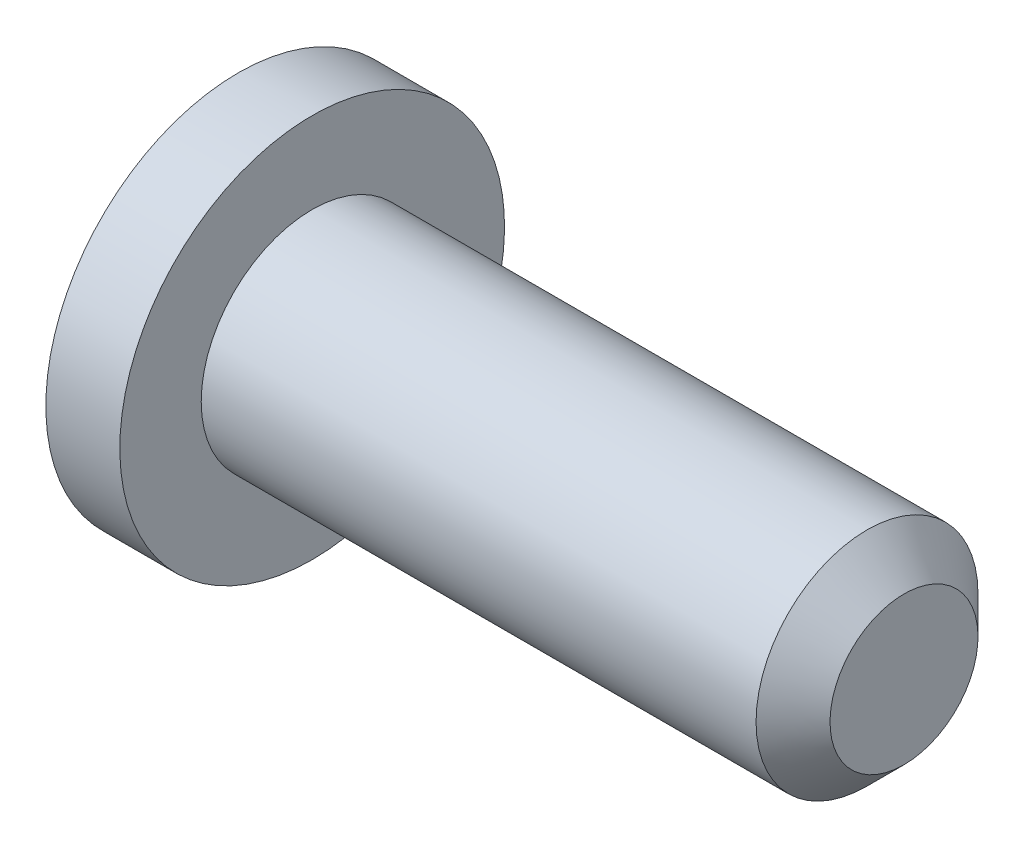
ISO-10303-21;
HEADER;
FILE_DESCRIPTION(('STEP AP214'),'2;1');
FILE_NAME('part.step','',(''),(''),'','','');
FILE_SCHEMA(('AUTOMOTIVE_DESIGN { 1 0 10303 214 1 1 1 1 }'));
ENDSEC;
DATA;
#1=APPLICATION_CONTEXT('core data for automotive mechanical design processes');
#2=APPLICATION_PROTOCOL_DEFINITION('international standard','automotive_design',2000,#1);
#3=PRODUCT_CONTEXT('',#1,'mechanical');
#4=PRODUCT('Part','Part','',(#3));
#5=PRODUCT_RELATED_PRODUCT_CATEGORY('part','',(#4));
#6=PRODUCT_DEFINITION_FORMATION('','',#4);
#7=PRODUCT_DEFINITION_CONTEXT('part definition',#1,'design');
#8=PRODUCT_DEFINITION('design','',#6,#7);
#9=PRODUCT_DEFINITION_SHAPE('','',#8);
#10=(LENGTH_UNIT() NAMED_UNIT(*) SI_UNIT(.MILLI.,.METRE.));
#11=(NAMED_UNIT(*) PLANE_ANGLE_UNIT() SI_UNIT($,.RADIAN.));
#12=(NAMED_UNIT(*) SI_UNIT($,.STERADIAN.) SOLID_ANGLE_UNIT());
#13=UNCERTAINTY_MEASURE_WITH_UNIT(LENGTH_MEASURE(1.E-05),#10,'distance_accuracy_value','');
#14=(GEOMETRIC_REPRESENTATION_CONTEXT(3) GLOBAL_UNCERTAINTY_ASSIGNED_CONTEXT((#13)) GLOBAL_UNIT_ASSIGNED_CONTEXT((#10,
#11,#12)) REPRESENTATION_CONTEXT('',''));
#15=CARTESIAN_POINT('',(0.,0.,0.));
#16=DIRECTION('',(0.,0.,1.));
#17=DIRECTION('',(1.,0.,0.));
#18=AXIS2_PLACEMENT_3D('',#15,#16,#17);
#19=CARTESIAN_POINT('',(-4.72916869918748,0.,0.));
#20=DIRECTION('',(-1.,0.,0.));
#21=DIRECTION('',(0.,1.,0.));
#22=AXIS2_PLACEMENT_3D('',#19,#20,#21);
#23=SPHERICAL_SURFACE('',#22,5.);
#24=CARTESIAN_POINT('',(-9.,0.,0.));
#25=DIRECTION('',(-1.,0.,0.));
#26=DIRECTION('',(0.,-1.,0.));
#27=AXIS2_PLACEMENT_3D('',#24,#25,#26);
#28=CIRCLE('',#27,2.6);
#29=CARTESIAN_POINT('',(-9.,-2.6,0.));
#30=VERTEX_POINT('',#29);
#31=EDGE_CURVE('E203',#30,#30,#28,.T.);
#32=ORIENTED_EDGE('',*,*,#31,.T.);
#33=EDGE_LOOP('',(#32));
#34=FACE_BOUND('',#33,.T.);
#35=CARTESIAN_POINT('',(-4.72916869918748,0.,-0.25));
#36=DIRECTION('',(0.,0.,1.));
#37=DIRECTION('',(1.,0.,0.));
#38=AXIS2_PLACEMENT_3D('',#35,#36,#37);
#39=CIRCLE('',#38,4.99374608885954);
#40=CARTESIAN_POINT('',(-9.49230842000189,1.5,-0.25));
#41=VERTEX_POINT('',#40);
#42=CARTESIAN_POINT('',(-9.71665303500247,0.249999999999998,-0.25));
#43=VERTEX_POINT('',#42);
#44=EDGE_CURVE('E237',#41,#43,#39,.T.);
#45=ORIENTED_EDGE('',*,*,#44,.F.);
#46=CARTESIAN_POINT('',(-4.72916869918748,1.5,0.));
#47=DIRECTION('',(0.,1.,0.));
#48=DIRECTION('',(-1.,0.,0.));
#49=AXIS2_PLACEMENT_3D('',#46,#47,#48);
#50=CIRCLE('',#49,4.76969600708473);
#51=CARTESIAN_POINT('',(-9.49230842000189,1.5,0.25));
#52=VERTEX_POINT('',#51);
#53=EDGE_CURVE('E60',#41,#52,#50,.T.);
#54=ORIENTED_EDGE('',*,*,#53,.T.);
#55=CARTESIAN_POINT('',(-4.72916869918748,0.,0.25));
#56=DIRECTION('',(0.,0.,1.));
#57=DIRECTION('',(1.,0.,0.));
#58=AXIS2_PLACEMENT_3D('',#55,#56,#57);
#59=CIRCLE('',#58,4.99374608885954);
#60=CARTESIAN_POINT('',(-9.71665303500247,0.250000000000001,0.25));
#61=VERTEX_POINT('',#60);
#62=EDGE_CURVE('E233',#52,#61,#59,.T.);
#63=ORIENTED_EDGE('',*,*,#62,.T.);
#64=CARTESIAN_POINT('',(-4.72916869918748,0.249999999999999,0.));
#65=DIRECTION('',(0.,-1.,0.));
#66=DIRECTION('',(0.,0.,-1.));
#67=AXIS2_PLACEMENT_3D('',#64,#65,#66);
#68=CIRCLE('',#67,4.99374608885954);
#69=CARTESIAN_POINT('',(-9.49230842000189,0.250000000000014,1.5));
#70=VERTEX_POINT('',#69);
#71=EDGE_CURVE('E231',#70,#61,#68,.T.);
#72=ORIENTED_EDGE('',*,*,#71,.F.);
#73=CARTESIAN_POINT('',(-4.72916869918748,0.,1.5));
#74=DIRECTION('',(0.,0.,1.));
#75=DIRECTION('',(0.,-1.,0.));
#76=AXIS2_PLACEMENT_3D('',#73,#74,#75);
#77=CIRCLE('',#76,4.76969600708473);
#78=CARTESIAN_POINT('',(-9.49230842000189,-0.249999999999986,1.5));
#79=VERTEX_POINT('',#78);
#80=EDGE_CURVE('E228',#70,#79,#77,.T.);
#81=ORIENTED_EDGE('',*,*,#80,.T.);
#82=CARTESIAN_POINT('',(-4.72916869918748,-0.250000000000001,0.));
#83=DIRECTION('',(0.,-1.,0.));
#84=DIRECTION('',(0.,0.,-1.));
#85=AXIS2_PLACEMENT_3D('',#82,#83,#84);
#86=CIRCLE('',#85,4.99374608885954);
#87=CARTESIAN_POINT('',(-9.71665303500247,-0.249999999999999,0.250000000000002));
#88=VERTEX_POINT('',#87);
#89=EDGE_CURVE('E225',#79,#88,#86,.T.);
#90=ORIENTED_EDGE('',*,*,#89,.T.);
#91=CARTESIAN_POINT('',(-4.72916869918748,0.,0.25));
#92=DIRECTION('',(0.,0.,-1.));
#93=DIRECTION('',(0.,1.,0.));
#94=AXIS2_PLACEMENT_3D('',#91,#92,#93);
#95=CIRCLE('',#94,4.99374608885954);
#96=CARTESIAN_POINT('',(-9.49230842000189,-1.5,0.25000000000001));
#97=VERTEX_POINT('',#96);
#98=EDGE_CURVE('E223',#97,#88,#95,.T.);
#99=ORIENTED_EDGE('',*,*,#98,.F.);
#100=CARTESIAN_POINT('',(-4.72916869918748,-1.5,0.));
#101=DIRECTION('',(0.,-1.,0.));
#102=DIRECTION('',(0.,0.,-1.));
#103=AXIS2_PLACEMENT_3D('',#100,#101,#102);
#104=CIRCLE('',#103,4.76969600708473);
#105=CARTESIAN_POINT('',(-9.49230842000189,-1.5,-0.24999999999999));
#106=VERTEX_POINT('',#105);
#107=EDGE_CURVE('E220',#97,#106,#104,.T.);
#108=ORIENTED_EDGE('',*,*,#107,.T.);
#109=CARTESIAN_POINT('',(-4.72916869918748,0.,-0.25));
#110=DIRECTION('',(0.,0.,-1.));
#111=DIRECTION('',(0.,1.,0.));
#112=AXIS2_PLACEMENT_3D('',#109,#110,#111);
#113=CIRCLE('',#112,4.99374608885954);
#114=CARTESIAN_POINT('',(-9.71665303500248,-0.250000000000002,-0.249999999999998));
#115=VERTEX_POINT('',#114);
#116=EDGE_CURVE('E217',#106,#115,#113,.T.);
#117=ORIENTED_EDGE('',*,*,#116,.T.);
#118=CARTESIAN_POINT('',(-4.72916869918748,-0.250000000000001,0.));
#119=DIRECTION('',(0.,1.,0.));
#120=DIRECTION('',(0.,0.,1.));
#121=AXIS2_PLACEMENT_3D('',#118,#119,#120);
#122=CIRCLE('',#121,4.99374608885954);
#123=CARTESIAN_POINT('',(-9.49230842000189,-0.250000000000007,-1.5));
#124=VERTEX_POINT('',#123);
#125=EDGE_CURVE('E215',#124,#115,#122,.T.);
#126=ORIENTED_EDGE('',*,*,#125,.F.);
#127=CARTESIAN_POINT('',(-4.72916869918748,0.,-1.5));
#128=DIRECTION('',(0.,0.,-1.));
#129=DIRECTION('',(0.,1.,0.));
#130=AXIS2_PLACEMENT_3D('',#127,#128,#129);
#131=CIRCLE('',#130,4.76969600708473);
#132=CARTESIAN_POINT('',(-9.49230842000189,0.249999999999993,-1.5));
#133=VERTEX_POINT('',#132);
#134=EDGE_CURVE('E212',#124,#133,#131,.T.);
#135=ORIENTED_EDGE('',*,*,#134,.T.);
#136=CARTESIAN_POINT('',(-4.72916869918748,0.249999999999999,0.));
#137=DIRECTION('',(0.,1.,0.));
#138=DIRECTION('',(0.,0.,1.));
#139=AXIS2_PLACEMENT_3D('',#136,#137,#138);
#140=CIRCLE('',#139,4.99374608885954);
#141=EDGE_CURVE('E209',#133,#43,#140,.T.);
#142=ORIENTED_EDGE('',*,*,#141,.T.);
#143=EDGE_LOOP('',(#45,#54,#63,#72,#81,#90,#99,#108,#117,#126,#135,#142));
#144=FACE_BOUND('',#143,.T.);
#145=ADVANCED_FACE('F37',(#34,#144),#23,.T.);
#146=CARTESIAN_POINT('',(-8.,1.5,0.));
#147=DIRECTION('',(-1.,0.,0.));
#148=DIRECTION('',(0.,-1.,0.));
#149=AXIS2_PLACEMENT_3D('',#146,#147,#148);
#150=PLANE('',#149);
#151=CARTESIAN_POINT('',(-8.,0.,0.));
#152=DIRECTION('',(-1.,0.,0.));
#153=DIRECTION('',(0.,-1.,0.));
#154=AXIS2_PLACEMENT_3D('',#151,#152,#153);
#155=CIRCLE('',#154,2.6);
#156=CARTESIAN_POINT('',(-8.,-2.6,0.));
#157=VERTEX_POINT('',#156);
#158=EDGE_CURVE('E139',#157,#157,#155,.T.);
#159=ORIENTED_EDGE('',*,*,#158,.F.);
#160=EDGE_LOOP('',(#159));
#161=FACE_BOUND('',#160,.T.);
#162=CARTESIAN_POINT('',(-8.,0.,0.));
#163=DIRECTION('',(-1.,0.,0.));
#164=DIRECTION('',(0.,-1.,0.));
#165=AXIS2_PLACEMENT_3D('',#162,#163,#164);
#166=CIRCLE('',#165,1.5);
#167=CARTESIAN_POINT('',(-8.,-1.5,0.));
#168=VERTEX_POINT('',#167);
#169=EDGE_CURVE('E206',#168,#168,#166,.T.);
#170=ORIENTED_EDGE('',*,*,#169,.T.);
#171=EDGE_LOOP('',(#170));
#172=FACE_BOUND('',#171,.T.);
#173=ADVANCED_FACE('F253',(#161,#172),#150,.F.);
#174=CARTESIAN_POINT('',(-9.72916869918748,0.,0.));
#175=DIRECTION('',(-1.,0.,0.));
#176=DIRECTION('',(0.,-1.,0.));
#177=AXIS2_PLACEMENT_3D('',#174,#175,#176);
#178=CYLINDRICAL_SURFACE('',#177,1.5);
#179=CARTESIAN_POINT('',(-0.500000000000004,0.,0.));
#180=DIRECTION('',(-1.,0.,0.));
#181=DIRECTION('',(0.,-1.,0.));
#182=AXIS2_PLACEMENT_3D('',#179,#180,#181);
#183=CIRCLE('',#182,1.5);
#184=CARTESIAN_POINT('',(-0.500000000000004,-1.5,0.));
#185=VERTEX_POINT('',#184);
#186=EDGE_CURVE('E45',#185,#185,#183,.T.);
#187=ORIENTED_EDGE('',*,*,#186,.T.);
#188=EDGE_LOOP('',(#187));
#189=FACE_BOUND('',#188,.T.);
#190=ORIENTED_EDGE('',*,*,#169,.F.);
#191=EDGE_LOOP('',(#190));
#192=FACE_BOUND('',#191,.T.);
#193=ADVANCED_FACE('F241',(#189,#192),#178,.T.);
#194=CARTESIAN_POINT('',(0.,1.5,0.));
#195=DIRECTION('',(-1.,0.,0.));
#196=DIRECTION('',(0.,-1.,0.));
#197=AXIS2_PLACEMENT_3D('',#194,#195,#196);
#198=PLANE('',#197);
#199=CARTESIAN_POINT('',(0.,0.,0.));
#200=DIRECTION('',(-1.,0.,0.));
#201=DIRECTION('',(0.,-1.,0.));
#202=AXIS2_PLACEMENT_3D('',#199,#200,#201);
#203=CIRCLE('',#202,0.999999999999995);
#204=CARTESIAN_POINT('',(0.,-0.999999999999995,0.));
#205=VERTEX_POINT('',#204);
#206=EDGE_CURVE('E11',#205,#205,#203,.F.);
#207=ORIENTED_EDGE('',*,*,#206,.T.);
#208=EDGE_LOOP('',(#207));
#209=FACE_BOUND('',#208,.T.);
#210=ADVANCED_FACE('F265',(#209),#198,.F.);
#211=CARTESIAN_POINT('',(-9.72916869918748,0.,0.));
#212=DIRECTION('',(-1.,0.,0.));
#213=DIRECTION('',(0.,-1.,0.));
#214=AXIS2_PLACEMENT_3D('',#211,#212,#213);
#215=CYLINDRICAL_SURFACE('',#214,2.6);
#216=ORIENTED_EDGE('',*,*,#31,.F.);
#217=EDGE_LOOP('',(#216));
#218=FACE_BOUND('',#217,.T.);
#219=ORIENTED_EDGE('',*,*,#158,.T.);
#220=EDGE_LOOP('',(#219));
#221=FACE_BOUND('',#220,.T.);
#222=ADVANCED_FACE('F263',(#218,#221),#215,.T.);
#223=CARTESIAN_POINT('',(-8.5,0.249999999999998,-0.25));
#224=DIRECTION('',(0.,0.,1.));
#225=DIRECTION('',(1.,0.,0.));
#226=AXIS2_PLACEMENT_3D('',#223,#224,#225);
#227=PLANE('',#226);
#228=ORIENTED_EDGE('',*,*,#44,.T.);
#229=DIRECTION('',(-1.,0.,0.));
#230=VECTOR('',#229,1.);
#231=CARTESIAN_POINT('',(-8.5,0.249999999999998,-0.25));
#232=LINE('',#231,#230);
#233=CARTESIAN_POINT('',(-8.5,0.249999999999998,-0.25));
#234=VERTEX_POINT('',#233);
#235=EDGE_CURVE('E52',#234,#43,#232,.T.);
#236=ORIENTED_EDGE('',*,*,#235,.F.);
#237=DIRECTION('',(0.,1.,0.));
#238=VECTOR('',#237,1.);
#239=CARTESIAN_POINT('',(-8.5,0.249999999999998,-0.25));
#240=LINE('',#239,#238);
#241=CARTESIAN_POINT('',(-8.5,1.5,-0.25));
#242=VERTEX_POINT('',#241);
#243=EDGE_CURVE('E127',#234,#242,#240,.T.);
#244=ORIENTED_EDGE('',*,*,#243,.T.);
#245=DIRECTION('',(-1.,0.,0.));
#246=VECTOR('',#245,1.);
#247=CARTESIAN_POINT('',(-8.5,1.5,-0.25));
#248=LINE('',#247,#246);
#249=EDGE_CURVE('E129',#242,#41,#248,.T.);
#250=ORIENTED_EDGE('',*,*,#249,.T.);
#251=EDGE_LOOP('',(#228,#236,#244,#250));
#252=FACE_BOUND('',#251,.T.);
#253=ADVANCED_FACE('F128',(#252),#227,.T.);
#254=CARTESIAN_POINT('',(-8.5,1.5,0.25));
#255=DIRECTION('',(0.,1.,0.));
#256=DIRECTION('',(-1.,0.,0.));
#257=AXIS2_PLACEMENT_3D('',#254,#255,#256);
#258=PLANE('',#257);
#259=ORIENTED_EDGE('',*,*,#249,.F.);
#260=DIRECTION('',(0.,0.,-1.));
#261=VECTOR('',#260,1.);
#262=CARTESIAN_POINT('',(-8.5,1.5,0.25));
#263=LINE('',#262,#261);
#264=CARTESIAN_POINT('',(-8.5,1.5,0.25));
#265=VERTEX_POINT('',#264);
#266=EDGE_CURVE('E134',#265,#242,#263,.T.);
#267=ORIENTED_EDGE('',*,*,#266,.F.);
#268=DIRECTION('',(-1.,0.,0.));
#269=VECTOR('',#268,1.);
#270=CARTESIAN_POINT('',(-8.5,1.5,0.25));
#271=LINE('',#270,#269);
#272=EDGE_CURVE('E140',#265,#52,#271,.T.);
#273=ORIENTED_EDGE('',*,*,#272,.T.);
#274=ORIENTED_EDGE('',*,*,#53,.F.);
#275=EDGE_LOOP('',(#259,#267,#273,#274));
#276=FACE_BOUND('',#275,.T.);
#277=ADVANCED_FACE('F137',(#276),#258,.F.);
#278=CARTESIAN_POINT('',(-8.5,0.250000000000001,0.25));
#279=DIRECTION('',(0.,0.,1.));
#280=DIRECTION('',(1.,0.,0.));
#281=AXIS2_PLACEMENT_3D('',#278,#279,#280);
#282=PLANE('',#281);
#283=ORIENTED_EDGE('',*,*,#272,.F.);
#284=DIRECTION('',(0.,1.,0.));
#285=VECTOR('',#284,1.);
#286=CARTESIAN_POINT('',(-8.5,0.250000000000001,0.25));
#287=LINE('',#286,#285);
#288=CARTESIAN_POINT('',(-8.5,0.250000000000001,0.25));
#289=VERTEX_POINT('',#288);
#290=EDGE_CURVE('E145',#289,#265,#287,.T.);
#291=ORIENTED_EDGE('',*,*,#290,.F.);
#292=DIRECTION('',(-1.,0.,0.));
#293=VECTOR('',#292,1.);
#294=CARTESIAN_POINT('',(-8.5,0.250000000000001,0.25));
#295=LINE('',#294,#293);
#296=EDGE_CURVE('E197',#289,#61,#295,.T.);
#297=ORIENTED_EDGE('',*,*,#296,.T.);
#298=ORIENTED_EDGE('',*,*,#62,.F.);
#299=EDGE_LOOP('',(#283,#291,#297,#298));
#300=FACE_BOUND('',#299,.T.);
#301=ADVANCED_FACE('F296',(#300),#282,.F.);
#302=CARTESIAN_POINT('',(-8.5,0.250000000000001,0.25));
#303=DIRECTION('',(0.,-1.,0.));
#304=DIRECTION('',(0.,0.,-1.));
#305=AXIS2_PLACEMENT_3D('',#302,#303,#304);
#306=PLANE('',#305);
#307=ORIENTED_EDGE('',*,*,#71,.T.);
#308=ORIENTED_EDGE('',*,*,#296,.F.);
#309=DIRECTION('',(0.,0.,1.));
#310=VECTOR('',#309,1.);
#311=CARTESIAN_POINT('',(-8.5,0.250000000000001,0.25));
#312=LINE('',#311,#310);
#313=CARTESIAN_POINT('',(-8.5,0.250000000000015,1.5));
#314=VERTEX_POINT('',#313);
#315=EDGE_CURVE('E147',#289,#314,#312,.T.);
#316=ORIENTED_EDGE('',*,*,#315,.T.);
#317=DIRECTION('',(-1.,0.,0.));
#318=VECTOR('',#317,1.);
#319=CARTESIAN_POINT('',(-8.5,0.250000000000015,1.5));
#320=LINE('',#319,#318);
#321=EDGE_CURVE('E194',#314,#70,#320,.T.);
#322=ORIENTED_EDGE('',*,*,#321,.T.);
#323=EDGE_LOOP('',(#307,#308,#316,#322));
#324=FACE_BOUND('',#323,.T.);
#325=ADVANCED_FACE('F303',(#324),#306,.T.);
#326=CARTESIAN_POINT('',(-8.5,-0.249999999999985,1.5));
#327=DIRECTION('',(0.,0.,1.));
#328=DIRECTION('',(0.,-1.,0.));
#329=AXIS2_PLACEMENT_3D('',#326,#327,#328);
#330=PLANE('',#329);
#331=ORIENTED_EDGE('',*,*,#321,.F.);
#332=DIRECTION('',(0.,1.,0.));
#333=VECTOR('',#332,1.);
#334=CARTESIAN_POINT('',(-8.5,-0.249999999999985,1.5));
#335=LINE('',#334,#333);
#336=CARTESIAN_POINT('',(-8.5,-0.249999999999985,1.5));
#337=VERTEX_POINT('',#336);
#338=EDGE_CURVE('E151',#337,#314,#335,.T.);
#339=ORIENTED_EDGE('',*,*,#338,.F.);
#340=DIRECTION('',(-1.,0.,0.));
#341=VECTOR('',#340,1.);
#342=CARTESIAN_POINT('',(-8.5,-0.249999999999985,1.5));
#343=LINE('',#342,#341);
#344=EDGE_CURVE('E191',#337,#79,#343,.T.);
#345=ORIENTED_EDGE('',*,*,#344,.T.);
#346=ORIENTED_EDGE('',*,*,#80,.F.);
#347=EDGE_LOOP('',(#331,#339,#345,#346));
#348=FACE_BOUND('',#347,.T.);
#349=ADVANCED_FACE('F311',(#348),#330,.F.);
#350=CARTESIAN_POINT('',(-8.5,-0.249999999999999,0.250000000000002));
#351=DIRECTION('',(0.,-1.,0.));
#352=DIRECTION('',(0.,0.,-1.));
#353=AXIS2_PLACEMENT_3D('',#350,#351,#352);
#354=PLANE('',#353);
#355=ORIENTED_EDGE('',*,*,#344,.F.);
#356=DIRECTION('',(0.,0.,1.));
#357=VECTOR('',#356,1.);
#358=CARTESIAN_POINT('',(-8.5,-0.249999999999999,0.250000000000002));
#359=LINE('',#358,#357);
#360=CARTESIAN_POINT('',(-8.5,-0.249999999999999,0.250000000000002));
#361=VERTEX_POINT('',#360);
#362=EDGE_CURVE('E154',#361,#337,#359,.T.);
#363=ORIENTED_EDGE('',*,*,#362,.F.);
#364=DIRECTION('',(-1.,0.,0.));
#365=VECTOR('',#364,1.);
#366=CARTESIAN_POINT('',(-8.5,-0.249999999999999,0.250000000000002));
#367=LINE('',#366,#365);
#368=EDGE_CURVE('E188',#361,#88,#367,.T.);
#369=ORIENTED_EDGE('',*,*,#368,.T.);
#370=ORIENTED_EDGE('',*,*,#89,.F.);
#371=EDGE_LOOP('',(#355,#363,#369,#370));
#372=FACE_BOUND('',#371,.T.);
#373=ADVANCED_FACE('F319',(#372),#354,.F.);
#374=CARTESIAN_POINT('',(-8.5,-0.249999999999999,0.250000000000002));
#375=DIRECTION('',(0.,0.,-1.));
#376=DIRECTION('',(0.,1.,0.));
#377=AXIS2_PLACEMENT_3D('',#374,#375,#376);
#378=PLANE('',#377);
#379=ORIENTED_EDGE('',*,*,#98,.T.);
#380=ORIENTED_EDGE('',*,*,#368,.F.);
#381=DIRECTION('',(0.,-1.,0.));
#382=VECTOR('',#381,1.);
#383=CARTESIAN_POINT('',(-8.5,-0.249999999999999,0.250000000000002));
#384=LINE('',#383,#382);
#385=CARTESIAN_POINT('',(-8.5,-1.5,0.25000000000001));
#386=VERTEX_POINT('',#385);
#387=EDGE_CURVE('E157',#361,#386,#384,.T.);
#388=ORIENTED_EDGE('',*,*,#387,.T.);
#389=DIRECTION('',(-1.,0.,0.));
#390=VECTOR('',#389,1.);
#391=CARTESIAN_POINT('',(-8.5,-1.5,0.25000000000001));
#392=LINE('',#391,#390);
#393=EDGE_CURVE('E185',#386,#97,#392,.T.);
#394=ORIENTED_EDGE('',*,*,#393,.T.);
#395=EDGE_LOOP('',(#379,#380,#388,#394));
#396=FACE_BOUND('',#395,.T.);
#397=ADVANCED_FACE('F327',(#396),#378,.T.);
#398=CARTESIAN_POINT('',(-8.5,-1.5,-0.24999999999999));
#399=DIRECTION('',(0.,-1.,0.));
#400=DIRECTION('',(0.,0.,-1.));
#401=AXIS2_PLACEMENT_3D('',#398,#399,#400);
#402=PLANE('',#401);
#403=ORIENTED_EDGE('',*,*,#393,.F.);
#404=DIRECTION('',(0.,0.,1.));
#405=VECTOR('',#404,1.);
#406=CARTESIAN_POINT('',(-8.5,-1.5,-0.24999999999999));
#407=LINE('',#406,#405);
#408=CARTESIAN_POINT('',(-8.5,-1.5,-0.24999999999999));
#409=VERTEX_POINT('',#408);
#410=EDGE_CURVE('E159',#409,#386,#407,.T.);
#411=ORIENTED_EDGE('',*,*,#410,.F.);
#412=DIRECTION('',(-1.,0.,0.));
#413=VECTOR('',#412,1.);
#414=CARTESIAN_POINT('',(-8.5,-1.5,-0.24999999999999));
#415=LINE('',#414,#413);
#416=EDGE_CURVE('E182',#409,#106,#415,.T.);
#417=ORIENTED_EDGE('',*,*,#416,.T.);
#418=ORIENTED_EDGE('',*,*,#107,.F.);
#419=EDGE_LOOP('',(#403,#411,#417,#418));
#420=FACE_BOUND('',#419,.T.);
#421=ADVANCED_FACE('F335',(#420),#402,.F.);
#422=CARTESIAN_POINT('',(-8.5,-0.250000000000002,-0.249999999999998));
#423=DIRECTION('',(0.,0.,-1.));
#424=DIRECTION('',(0.,1.,0.));
#425=AXIS2_PLACEMENT_3D('',#422,#423,#424);
#426=PLANE('',#425);
#427=ORIENTED_EDGE('',*,*,#416,.F.);
#428=DIRECTION('',(0.,-1.,0.));
#429=VECTOR('',#428,1.);
#430=CARTESIAN_POINT('',(-8.5,-0.250000000000002,-0.249999999999998));
#431=LINE('',#430,#429);
#432=CARTESIAN_POINT('',(-8.5,-0.250000000000002,-0.249999999999998));
#433=VERTEX_POINT('',#432);
#434=EDGE_CURVE('E162',#433,#409,#431,.T.);
#435=ORIENTED_EDGE('',*,*,#434,.F.);
#436=DIRECTION('',(-1.,0.,0.));
#437=VECTOR('',#436,1.);
#438=CARTESIAN_POINT('',(-8.5,-0.250000000000002,-0.249999999999998));
#439=LINE('',#438,#437);
#440=EDGE_CURVE('E179',#433,#115,#439,.T.);
#441=ORIENTED_EDGE('',*,*,#440,.T.);
#442=ORIENTED_EDGE('',*,*,#116,.F.);
#443=EDGE_LOOP('',(#427,#435,#441,#442));
#444=FACE_BOUND('',#443,.T.);
#445=ADVANCED_FACE('F343',(#444),#426,.F.);
#446=CARTESIAN_POINT('',(-8.5,-0.250000000000002,-0.249999999999998));
#447=DIRECTION('',(0.,1.,0.));
#448=DIRECTION('',(0.,0.,1.));
#449=AXIS2_PLACEMENT_3D('',#446,#447,#448);
#450=PLANE('',#449);
#451=ORIENTED_EDGE('',*,*,#125,.T.);
#452=ORIENTED_EDGE('',*,*,#440,.F.);
#453=DIRECTION('',(0.,0.,-1.));
#454=VECTOR('',#453,1.);
#455=CARTESIAN_POINT('',(-8.5,-0.250000000000002,-0.249999999999998));
#456=LINE('',#455,#454);
#457=CARTESIAN_POINT('',(-8.5,-0.250000000000006,-1.5));
#458=VERTEX_POINT('',#457);
#459=EDGE_CURVE('E165',#433,#458,#456,.T.);
#460=ORIENTED_EDGE('',*,*,#459,.T.);
#461=DIRECTION('',(-1.,0.,0.));
#462=VECTOR('',#461,1.);
#463=CARTESIAN_POINT('',(-8.5,-0.250000000000006,-1.5));
#464=LINE('',#463,#462);
#465=EDGE_CURVE('E176',#458,#124,#464,.T.);
#466=ORIENTED_EDGE('',*,*,#465,.T.);
#467=EDGE_LOOP('',(#451,#452,#460,#466));
#468=FACE_BOUND('',#467,.T.);
#469=ADVANCED_FACE('F351',(#468),#450,.T.);
#470=CARTESIAN_POINT('',(-8.5,0.249999999999994,-1.5));
#471=DIRECTION('',(0.,0.,-1.));
#472=DIRECTION('',(0.,1.,0.));
#473=AXIS2_PLACEMENT_3D('',#470,#471,#472);
#474=PLANE('',#473);
#475=ORIENTED_EDGE('',*,*,#465,.F.);
#476=DIRECTION('',(0.,-1.,0.));
#477=VECTOR('',#476,1.);
#478=CARTESIAN_POINT('',(-8.5,0.249999999999994,-1.5));
#479=LINE('',#478,#477);
#480=CARTESIAN_POINT('',(-8.5,0.249999999999994,-1.5));
#481=VERTEX_POINT('',#480);
#482=EDGE_CURVE('E167',#481,#458,#479,.T.);
#483=ORIENTED_EDGE('',*,*,#482,.F.);
#484=DIRECTION('',(-1.,0.,0.));
#485=VECTOR('',#484,1.);
#486=CARTESIAN_POINT('',(-8.5,0.249999999999994,-1.5));
#487=LINE('',#486,#485);
#488=EDGE_CURVE('E173',#481,#133,#487,.T.);
#489=ORIENTED_EDGE('',*,*,#488,.T.);
#490=ORIENTED_EDGE('',*,*,#134,.F.);
#491=EDGE_LOOP('',(#475,#483,#489,#490));
#492=FACE_BOUND('',#491,.T.);
#493=ADVANCED_FACE('F359',(#492),#474,.F.);
#494=CARTESIAN_POINT('',(-8.5,0.249999999999998,-0.25));
#495=DIRECTION('',(0.,1.,0.));
#496=DIRECTION('',(0.,0.,1.));
#497=AXIS2_PLACEMENT_3D('',#494,#495,#496);
#498=PLANE('',#497);
#499=ORIENTED_EDGE('',*,*,#488,.F.);
#500=DIRECTION('',(0.,0.,-1.));
#501=VECTOR('',#500,1.);
#502=CARTESIAN_POINT('',(-8.5,0.249999999999998,-0.25));
#503=LINE('',#502,#501);
#504=EDGE_CURVE('E170',#234,#481,#503,.T.);
#505=ORIENTED_EDGE('',*,*,#504,.F.);
#506=ORIENTED_EDGE('',*,*,#235,.T.);
#507=ORIENTED_EDGE('',*,*,#141,.F.);
#508=EDGE_LOOP('',(#499,#505,#506,#507));
#509=FACE_BOUND('',#508,.T.);
#510=ADVANCED_FACE('F249',(#509),#498,.F.);
#511=CARTESIAN_POINT('',(-8.5,0.,0.));
#512=DIRECTION('',(-1.,0.,0.));
#513=DIRECTION('',(0.,0.,1.));
#514=AXIS2_PLACEMENT_3D('',#511,#512,#513);
#515=PLANE('',#514);
#516=ORIENTED_EDGE('',*,*,#243,.F.);
#517=ORIENTED_EDGE('',*,*,#504,.T.);
#518=ORIENTED_EDGE('',*,*,#482,.T.);
#519=ORIENTED_EDGE('',*,*,#459,.F.);
#520=ORIENTED_EDGE('',*,*,#434,.T.);
#521=ORIENTED_EDGE('',*,*,#410,.T.);
#522=ORIENTED_EDGE('',*,*,#387,.F.);
#523=ORIENTED_EDGE('',*,*,#362,.T.);
#524=ORIENTED_EDGE('',*,*,#338,.T.);
#525=ORIENTED_EDGE('',*,*,#315,.F.);
#526=ORIENTED_EDGE('',*,*,#290,.T.);
#527=ORIENTED_EDGE('',*,*,#266,.T.);
#528=EDGE_LOOP('',(#516,#517,#518,#519,#520,#521,#522,#523,#524,#525,#526,#527));
#529=FACE_BOUND('',#528,.T.);
#530=ADVANCED_FACE('F142',(#529),#515,.T.);
#531=CARTESIAN_POINT('',(-0.500000000000004,0.,0.));
#532=DIRECTION('',(-1.,0.,0.));
#533=DIRECTION('',(0.,-1.,0.));
#534=AXIS2_PLACEMENT_3D('',#531,#532,#533);
#535=CONICAL_SURFACE('',#534,1.5,0.78539816339745);
#536=ORIENTED_EDGE('',*,*,#206,.F.);
#537=EDGE_LOOP('',(#536));
#538=FACE_BOUND('',#537,.T.);
#539=ORIENTED_EDGE('',*,*,#186,.F.);
#540=EDGE_LOOP('',(#539));
#541=FACE_BOUND('',#540,.T.);
#542=ADVANCED_FACE('F39',(#538,#541),#535,.T.);
#543=CLOSED_SHELL('',(#145,#173,#193,#210,#222,#253,#277,#301,#325,#349,#373,#397,#421,#445,
#469,#493,#510,#530,#542));
#544=MANIFOLD_SOLID_BREP('B2',#543);
#545=ADVANCED_BREP_SHAPE_REPRESENTATION('',(#18,#544),#14);
#546=SHAPE_DEFINITION_REPRESENTATION(#9,#545);
ENDSEC;
END-ISO-10303-21;
